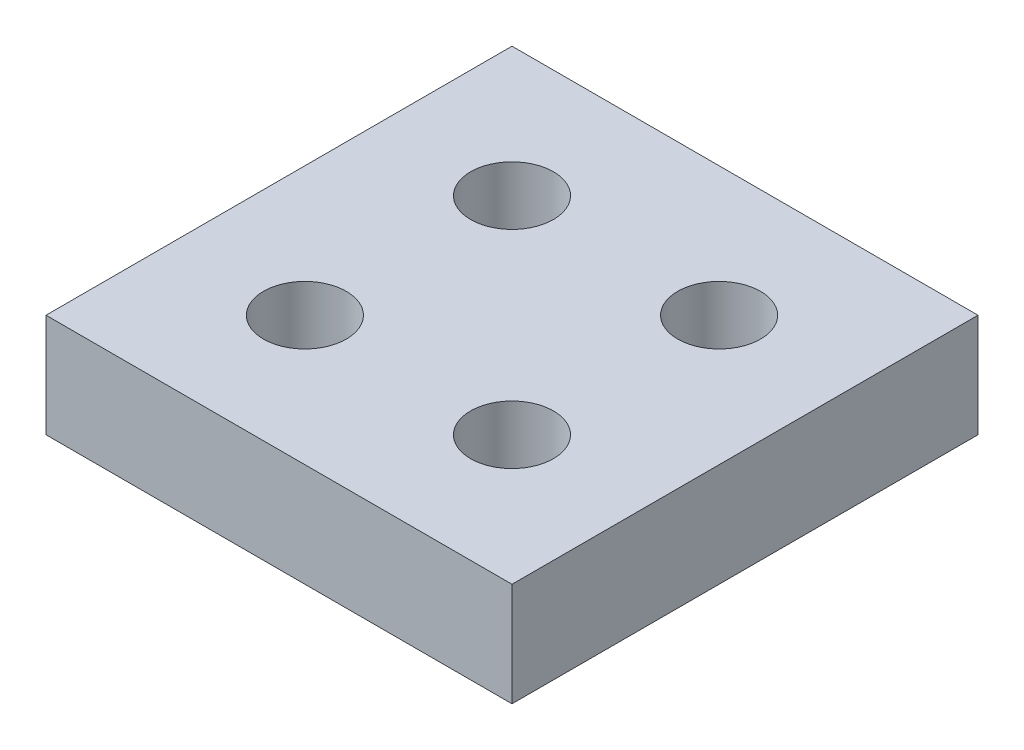
ISO-10303-21;
HEADER;
FILE_DESCRIPTION(('STEP AP214'),'2;1');
FILE_NAME('part.step','',(''),(''),'','','');
FILE_SCHEMA(('AUTOMOTIVE_DESIGN { 1 0 10303 214 1 1 1 1 }'));
ENDSEC;
DATA;
#1=APPLICATION_CONTEXT('core data for automotive mechanical design processes');
#2=APPLICATION_PROTOCOL_DEFINITION('international standard','automotive_design',2000,#1);
#3=PRODUCT_CONTEXT('',#1,'mechanical');
#4=PRODUCT('Part','Part','',(#3));
#5=PRODUCT_RELATED_PRODUCT_CATEGORY('part','',(#4));
#6=PRODUCT_DEFINITION_FORMATION('','',#4);
#7=PRODUCT_DEFINITION_CONTEXT('part definition',#1,'design');
#8=PRODUCT_DEFINITION('design','',#6,#7);
#9=PRODUCT_DEFINITION_SHAPE('','',#8);
#10=(LENGTH_UNIT() NAMED_UNIT(*) SI_UNIT(.MILLI.,.METRE.));
#11=(NAMED_UNIT(*) PLANE_ANGLE_UNIT() SI_UNIT($,.RADIAN.));
#12=(NAMED_UNIT(*) SI_UNIT($,.STERADIAN.) SOLID_ANGLE_UNIT());
#13=UNCERTAINTY_MEASURE_WITH_UNIT(LENGTH_MEASURE(1.E-05),#10,'distance_accuracy_value','');
#14=(GEOMETRIC_REPRESENTATION_CONTEXT(3) GLOBAL_UNCERTAINTY_ASSIGNED_CONTEXT((#13)) GLOBAL_UNIT_ASSIGNED_CONTEXT((#10,
#11,#12)) REPRESENTATION_CONTEXT('',''));
#15=CARTESIAN_POINT('',(0.,0.,0.));
#16=DIRECTION('',(0.,0.,1.));
#17=DIRECTION('',(1.,0.,0.));
#18=AXIS2_PLACEMENT_3D('',#15,#16,#17);
#19=CARTESIAN_POINT('',(0.,1.,0.));
#20=DIRECTION('',(0.,-1.,0.));
#21=DIRECTION('',(0.,0.,-1.));
#22=AXIS2_PLACEMENT_3D('',#19,#20,#21);
#23=PLANE('',#22);
#24=DIRECTION('',(0.,0.,-1.));
#25=VECTOR('',#24,1.);
#26=CARTESIAN_POINT('',(2.25,1.,2.24999999999999));
#27=LINE('',#26,#25);
#28=CARTESIAN_POINT('',(2.25,1.,2.24999999999999));
#29=VERTEX_POINT('',#28);
#30=CARTESIAN_POINT('',(2.25,1.,-2.24999999999999));
#31=VERTEX_POINT('',#30);
#32=EDGE_CURVE('E88',#29,#31,#27,.T.);
#33=ORIENTED_EDGE('',*,*,#32,.T.);
#34=DIRECTION('',(-1.,0.,0.));
#35=VECTOR('',#34,1.);
#36=CARTESIAN_POINT('',(-2.25,1.,-2.24999999999999));
#37=LINE('',#36,#35);
#38=CARTESIAN_POINT('',(-2.25,1.,-2.24999999999999));
#39=VERTEX_POINT('',#38);
#40=EDGE_CURVE('E83',#31,#39,#37,.T.);
#41=ORIENTED_EDGE('',*,*,#40,.T.);
#42=DIRECTION('',(0.,0.,1.));
#43=VECTOR('',#42,1.);
#44=CARTESIAN_POINT('',(-2.25,1.,2.24999999999999));
#45=LINE('',#44,#43);
#46=CARTESIAN_POINT('',(-2.25,1.,2.24999999999999));
#47=VERTEX_POINT('',#46);
#48=EDGE_CURVE('E86',#39,#47,#45,.T.);
#49=ORIENTED_EDGE('',*,*,#48,.T.);
#50=DIRECTION('',(1.,0.,0.));
#51=VECTOR('',#50,1.);
#52=CARTESIAN_POINT('',(-2.25,1.,2.24999999999999));
#53=LINE('',#52,#51);
#54=EDGE_CURVE('E53',#47,#29,#53,.T.);
#55=ORIENTED_EDGE('',*,*,#54,.T.);
#56=EDGE_LOOP('',(#33,#41,#49,#55));
#57=FACE_BOUND('',#56,.T.);
#58=CARTESIAN_POINT('',(-1.00000000000001,1.,-1.));
#59=DIRECTION('',(0.,1.,0.));
#60=DIRECTION('',(0.,0.,1.));
#61=AXIS2_PLACEMENT_3D('',#58,#59,#60);
#62=CIRCLE('',#61,0.399999999999999);
#63=CARTESIAN_POINT('',(-1.00000000000001,1.,-0.600000000000001));
#64=VERTEX_POINT('',#63);
#65=EDGE_CURVE('E103',#64,#64,#62,.T.);
#66=ORIENTED_EDGE('',*,*,#65,.F.);
#67=EDGE_LOOP('',(#66));
#68=FACE_BOUND('',#67,.T.);
#69=CARTESIAN_POINT('',(1.,1.,-1.00000000000007));
#70=DIRECTION('',(0.,1.,0.));
#71=DIRECTION('',(0.,0.,1.));
#72=AXIS2_PLACEMENT_3D('',#69,#70,#71);
#73=CIRCLE('',#72,0.4);
#74=CARTESIAN_POINT('',(1.,1.,-0.600000000000071));
#75=VERTEX_POINT('',#74);
#76=EDGE_CURVE('E118',#75,#75,#73,.T.);
#77=ORIENTED_EDGE('',*,*,#76,.F.);
#78=EDGE_LOOP('',(#77));
#79=FACE_BOUND('',#78,.T.);
#80=CARTESIAN_POINT('',(1.00000000000007,1.,0.999999999999934));
#81=DIRECTION('',(0.,1.,0.));
#82=DIRECTION('',(0.,0.,1.));
#83=AXIS2_PLACEMENT_3D('',#80,#81,#82);
#84=CIRCLE('',#83,0.4);
#85=CARTESIAN_POINT('',(1.00000000000007,1.,1.39999999999993));
#86=VERTEX_POINT('',#85);
#87=EDGE_CURVE('E124',#86,#86,#84,.T.);
#88=ORIENTED_EDGE('',*,*,#87,.F.);
#89=EDGE_LOOP('',(#88));
#90=FACE_BOUND('',#89,.T.);
#91=CARTESIAN_POINT('',(-0.999999999999934,1.,1.00000000000001));
#92=DIRECTION('',(0.,1.,0.));
#93=DIRECTION('',(0.,0.,1.));
#94=AXIS2_PLACEMENT_3D('',#91,#92,#93);
#95=CIRCLE('',#94,0.4);
#96=CARTESIAN_POINT('',(-0.999999999999934,1.,1.40000000000001));
#97=VERTEX_POINT('',#96);
#98=EDGE_CURVE('E130',#97,#97,#95,.T.);
#99=ORIENTED_EDGE('',*,*,#98,.F.);
#100=EDGE_LOOP('',(#99));
#101=FACE_BOUND('',#100,.T.);
#102=ADVANCED_FACE('F36',(#57,#68,#79,#90,#101),#23,.F.);
#103=CARTESIAN_POINT('',(0.,0.,0.));
#104=DIRECTION('',(0.,-1.,0.));
#105=DIRECTION('',(0.,0.,-1.));
#106=AXIS2_PLACEMENT_3D('',#103,#104,#105);
#107=PLANE('',#106);
#108=CARTESIAN_POINT('',(1.00000000000007,0.,0.999999999999934));
#109=DIRECTION('',(0.,1.,0.));
#110=DIRECTION('',(0.,0.,1.));
#111=AXIS2_PLACEMENT_3D('',#108,#109,#110);
#112=CIRCLE('',#111,0.4);
#113=CARTESIAN_POINT('',(1.00000000000007,0.,1.39999999999993));
#114=VERTEX_POINT('',#113);
#115=EDGE_CURVE('E127',#114,#114,#112,.T.);
#116=ORIENTED_EDGE('',*,*,#115,.T.);
#117=EDGE_LOOP('',(#116));
#118=FACE_BOUND('',#117,.T.);
#119=CARTESIAN_POINT('',(-1.00000000000001,0.,-1.));
#120=DIRECTION('',(0.,1.,0.));
#121=DIRECTION('',(0.,0.,1.));
#122=AXIS2_PLACEMENT_3D('',#119,#120,#121);
#123=CIRCLE('',#122,0.399999999999999);
#124=CARTESIAN_POINT('',(-1.00000000000001,0.,-0.600000000000001));
#125=VERTEX_POINT('',#124);
#126=EDGE_CURVE('E115',#125,#125,#123,.T.);
#127=ORIENTED_EDGE('',*,*,#126,.T.);
#128=EDGE_LOOP('',(#127));
#129=FACE_BOUND('',#128,.T.);
#130=DIRECTION('',(0.,0.,-1.));
#131=VECTOR('',#130,1.);
#132=CARTESIAN_POINT('',(2.25,0.,2.24999999999999));
#133=LINE('',#132,#131);
#134=CARTESIAN_POINT('',(2.25,0.,2.24999999999999));
#135=VERTEX_POINT('',#134);
#136=CARTESIAN_POINT('',(2.25,0.,-2.24999999999999));
#137=VERTEX_POINT('',#136);
#138=EDGE_CURVE('E100',#135,#137,#133,.T.);
#139=ORIENTED_EDGE('',*,*,#138,.F.);
#140=DIRECTION('',(1.,0.,0.));
#141=VECTOR('',#140,1.);
#142=CARTESIAN_POINT('',(-2.25,0.,2.24999999999999));
#143=LINE('',#142,#141);
#144=CARTESIAN_POINT('',(-2.25,0.,2.24999999999999));
#145=VERTEX_POINT('',#144);
#146=EDGE_CURVE('E76',#145,#135,#143,.T.);
#147=ORIENTED_EDGE('',*,*,#146,.F.);
#148=DIRECTION('',(0.,0.,1.));
#149=VECTOR('',#148,1.);
#150=CARTESIAN_POINT('',(-2.25,0.,2.24999999999999));
#151=LINE('',#150,#149);
#152=CARTESIAN_POINT('',(-2.25,0.,-2.24999999999999));
#153=VERTEX_POINT('',#152);
#154=EDGE_CURVE('E70',#153,#145,#151,.T.);
#155=ORIENTED_EDGE('',*,*,#154,.F.);
#156=DIRECTION('',(-1.,0.,0.));
#157=VECTOR('',#156,1.);
#158=CARTESIAN_POINT('',(-2.25,0.,-2.24999999999999));
#159=LINE('',#158,#157);
#160=EDGE_CURVE('E92',#137,#153,#159,.T.);
#161=ORIENTED_EDGE('',*,*,#160,.F.);
#162=EDGE_LOOP('',(#139,#147,#155,#161));
#163=FACE_BOUND('',#162,.T.);
#164=CARTESIAN_POINT('',(1.,0.,-1.00000000000007));
#165=DIRECTION('',(0.,1.,0.));
#166=DIRECTION('',(0.,0.,1.));
#167=AXIS2_PLACEMENT_3D('',#164,#165,#166);
#168=CIRCLE('',#167,0.4);
#169=CARTESIAN_POINT('',(1.,0.,-0.600000000000071));
#170=VERTEX_POINT('',#169);
#171=EDGE_CURVE('E121',#170,#170,#168,.T.);
#172=ORIENTED_EDGE('',*,*,#171,.T.);
#173=EDGE_LOOP('',(#172));
#174=FACE_BOUND('',#173,.T.);
#175=CARTESIAN_POINT('',(-0.999999999999934,0.,1.00000000000001));
#176=DIRECTION('',(0.,1.,0.));
#177=DIRECTION('',(0.,0.,1.));
#178=AXIS2_PLACEMENT_3D('',#175,#176,#177);
#179=CIRCLE('',#178,0.4);
#180=CARTESIAN_POINT('',(-0.999999999999934,0.,1.40000000000001));
#181=VERTEX_POINT('',#180);
#182=EDGE_CURVE('E133',#181,#181,#179,.T.);
#183=ORIENTED_EDGE('',*,*,#182,.T.);
#184=EDGE_LOOP('',(#183));
#185=FACE_BOUND('',#184,.T.);
#186=ADVANCED_FACE('F111',(#118,#129,#163,#174,#185),#107,.T.);
#187=CARTESIAN_POINT('',(2.25,1.,2.24999999999999));
#188=DIRECTION('',(-1.,0.,0.));
#189=DIRECTION('',(0.,0.,1.));
#190=AXIS2_PLACEMENT_3D('',#187,#188,#189);
#191=PLANE('',#190);
#192=ORIENTED_EDGE('',*,*,#138,.T.);
#193=DIRECTION('',(0.,-1.,0.));
#194=VECTOR('',#193,1.);
#195=CARTESIAN_POINT('',(2.25,1.,-2.24999999999999));
#196=LINE('',#195,#194);
#197=EDGE_CURVE('E11',#31,#137,#196,.T.);
#198=ORIENTED_EDGE('',*,*,#197,.F.);
#199=ORIENTED_EDGE('',*,*,#32,.F.);
#200=DIRECTION('',(0.,-1.,0.));
#201=VECTOR('',#200,1.);
#202=CARTESIAN_POINT('',(2.25,1.,2.24999999999999));
#203=LINE('',#202,#201);
#204=EDGE_CURVE('E96',#29,#135,#203,.T.);
#205=ORIENTED_EDGE('',*,*,#204,.T.);
#206=EDGE_LOOP('',(#192,#198,#199,#205));
#207=FACE_BOUND('',#206,.T.);
#208=ADVANCED_FACE('F38',(#207),#191,.F.);
#209=CARTESIAN_POINT('',(-2.25,1.,-2.24999999999999));
#210=DIRECTION('',(0.,0.,1.));
#211=DIRECTION('',(1.,0.,0.));
#212=AXIS2_PLACEMENT_3D('',#209,#210,#211);
#213=PLANE('',#212);
#214=ORIENTED_EDGE('',*,*,#160,.T.);
#215=DIRECTION('',(0.,-1.,0.));
#216=VECTOR('',#215,1.);
#217=CARTESIAN_POINT('',(-2.25,1.,-2.24999999999999));
#218=LINE('',#217,#216);
#219=EDGE_CURVE('E45',#39,#153,#218,.T.);
#220=ORIENTED_EDGE('',*,*,#219,.F.);
#221=ORIENTED_EDGE('',*,*,#40,.F.);
#222=ORIENTED_EDGE('',*,*,#197,.T.);
#223=EDGE_LOOP('',(#214,#220,#221,#222));
#224=FACE_BOUND('',#223,.T.);
#225=ADVANCED_FACE('F91',(#224),#213,.F.);
#226=CARTESIAN_POINT('',(-2.25,1.,2.24999999999999));
#227=DIRECTION('',(1.,0.,0.));
#228=DIRECTION('',(0.,0.,-1.));
#229=AXIS2_PLACEMENT_3D('',#226,#227,#228);
#230=PLANE('',#229);
#231=ORIENTED_EDGE('',*,*,#154,.T.);
#232=DIRECTION('',(0.,-1.,0.));
#233=VECTOR('',#232,1.);
#234=CARTESIAN_POINT('',(-2.25,1.,2.24999999999999));
#235=LINE('',#234,#233);
#236=EDGE_CURVE('E93',#47,#145,#235,.T.);
#237=ORIENTED_EDGE('',*,*,#236,.F.);
#238=ORIENTED_EDGE('',*,*,#48,.F.);
#239=ORIENTED_EDGE('',*,*,#219,.T.);
#240=EDGE_LOOP('',(#231,#237,#238,#239));
#241=FACE_BOUND('',#240,.T.);
#242=ADVANCED_FACE('F94',(#241),#230,.F.);
#243=CARTESIAN_POINT('',(-2.25,1.,2.24999999999999));
#244=DIRECTION('',(0.,0.,-1.));
#245=DIRECTION('',(-1.,0.,0.));
#246=AXIS2_PLACEMENT_3D('',#243,#244,#245);
#247=PLANE('',#246);
#248=ORIENTED_EDGE('',*,*,#146,.T.);
#249=ORIENTED_EDGE('',*,*,#204,.F.);
#250=ORIENTED_EDGE('',*,*,#54,.F.);
#251=ORIENTED_EDGE('',*,*,#236,.T.);
#252=EDGE_LOOP('',(#248,#249,#250,#251));
#253=FACE_BOUND('',#252,.T.);
#254=ADVANCED_FACE('F108',(#253),#247,.F.);
#255=CARTESIAN_POINT('',(-1.00000000000001,1.,-1.));
#256=DIRECTION('',(0.,-1.,0.));
#257=DIRECTION('',(0.,0.,-1.));
#258=AXIS2_PLACEMENT_3D('',#255,#256,#257);
#259=CYLINDRICAL_SURFACE('',#258,0.399999999999999);
#260=ORIENTED_EDGE('',*,*,#65,.T.);
#261=EDGE_LOOP('',(#260));
#262=FACE_BOUND('',#261,.T.);
#263=ORIENTED_EDGE('',*,*,#126,.F.);
#264=EDGE_LOOP('',(#263));
#265=FACE_BOUND('',#264,.T.);
#266=ADVANCED_FACE('F150',(#262,#265),#259,.F.);
#267=CARTESIAN_POINT('',(1.,1.,-1.00000000000007));
#268=DIRECTION('',(0.,-1.,0.));
#269=DIRECTION('',(0.,0.,-1.));
#270=AXIS2_PLACEMENT_3D('',#267,#268,#269);
#271=CYLINDRICAL_SURFACE('',#270,0.4);
#272=ORIENTED_EDGE('',*,*,#76,.T.);
#273=EDGE_LOOP('',(#272));
#274=FACE_BOUND('',#273,.T.);
#275=ORIENTED_EDGE('',*,*,#171,.F.);
#276=EDGE_LOOP('',(#275));
#277=FACE_BOUND('',#276,.T.);
#278=ADVANCED_FACE('F196',(#274,#277),#271,.F.);
#279=CARTESIAN_POINT('',(1.00000000000007,1.,0.999999999999934));
#280=DIRECTION('',(0.,-1.,0.));
#281=DIRECTION('',(0.,0.,-1.));
#282=AXIS2_PLACEMENT_3D('',#279,#280,#281);
#283=CYLINDRICAL_SURFACE('',#282,0.4);
#284=ORIENTED_EDGE('',*,*,#87,.T.);
#285=EDGE_LOOP('',(#284));
#286=FACE_BOUND('',#285,.T.);
#287=ORIENTED_EDGE('',*,*,#115,.F.);
#288=EDGE_LOOP('',(#287));
#289=FACE_BOUND('',#288,.T.);
#290=ADVANCED_FACE('F204',(#286,#289),#283,.F.);
#291=CARTESIAN_POINT('',(-0.999999999999934,1.,1.00000000000001));
#292=DIRECTION('',(0.,-1.,0.));
#293=DIRECTION('',(0.,0.,-1.));
#294=AXIS2_PLACEMENT_3D('',#291,#292,#293);
#295=CYLINDRICAL_SURFACE('',#294,0.4);
#296=ORIENTED_EDGE('',*,*,#98,.T.);
#297=EDGE_LOOP('',(#296));
#298=FACE_BOUND('',#297,.T.);
#299=ORIENTED_EDGE('',*,*,#182,.F.);
#300=EDGE_LOOP('',(#299));
#301=FACE_BOUND('',#300,.T.);
#302=ADVANCED_FACE('F139',(#298,#301),#295,.F.);
#303=CLOSED_SHELL('',(#102,#186,#208,#225,#242,#254,#266,#278,#290,#302));
#304=MANIFOLD_SOLID_BREP('B2',#303);
#305=ADVANCED_BREP_SHAPE_REPRESENTATION('',(#18,#304),#14);
#306=SHAPE_DEFINITION_REPRESENTATION(#9,#305);
ENDSEC;
END-ISO-10303-21;
